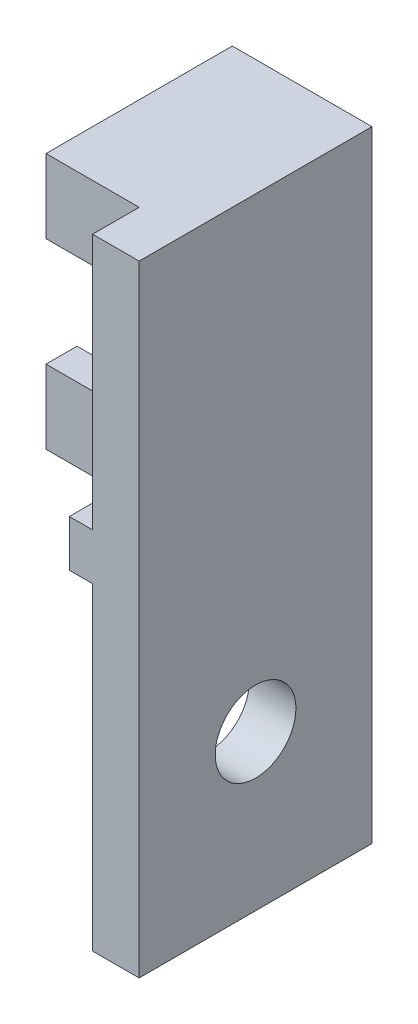
ISO-10303-21;
HEADER;
FILE_DESCRIPTION(('STEP AP214'),'2;1');
FILE_NAME('part.step','',(''),(''),'','','');
FILE_SCHEMA(('AUTOMOTIVE_DESIGN { 1 0 10303 214 1 1 1 1 }'));
ENDSEC;
DATA;
#1=APPLICATION_CONTEXT('core data for automotive mechanical design processes');
#2=APPLICATION_PROTOCOL_DEFINITION('international standard','automotive_design',2000,#1);
#3=PRODUCT_CONTEXT('',#1,'mechanical');
#4=PRODUCT('Part','Part','',(#3));
#5=PRODUCT_RELATED_PRODUCT_CATEGORY('part','',(#4));
#6=PRODUCT_DEFINITION_FORMATION('','',#4);
#7=PRODUCT_DEFINITION_CONTEXT('part definition',#1,'design');
#8=PRODUCT_DEFINITION('design','',#6,#7);
#9=PRODUCT_DEFINITION_SHAPE('','',#8);
#10=(LENGTH_UNIT() NAMED_UNIT(*) SI_UNIT(.MILLI.,.METRE.));
#11=(NAMED_UNIT(*) PLANE_ANGLE_UNIT() SI_UNIT($,.RADIAN.));
#12=(NAMED_UNIT(*) SI_UNIT($,.STERADIAN.) SOLID_ANGLE_UNIT());
#13=UNCERTAINTY_MEASURE_WITH_UNIT(LENGTH_MEASURE(1.E-05),#10,'distance_accuracy_value','');
#14=(GEOMETRIC_REPRESENTATION_CONTEXT(3) GLOBAL_UNCERTAINTY_ASSIGNED_CONTEXT((#13)) GLOBAL_UNIT_ASSIGNED_CONTEXT((#10,
#11,#12)) REPRESENTATION_CONTEXT('',''));
#15=CARTESIAN_POINT('',(0.,0.,0.));
#16=DIRECTION('',(0.,0.,1.));
#17=DIRECTION('',(1.,0.,0.));
#18=AXIS2_PLACEMENT_3D('',#15,#16,#17);
#19=CARTESIAN_POINT('',(-6.,40.,-3.));
#20=DIRECTION('',(0.,0.,-1.));
#21=DIRECTION('',(0.,1.,0.));
#22=AXIS2_PLACEMENT_3D('',#19,#20,#21);
#23=PLANE('',#22);
#24=DIRECTION('',(0.,1.,0.));
#25=VECTOR('',#24,1.);
#26=CARTESIAN_POINT('',(-6.,40.,-3.));
#27=LINE('',#26,#25);
#28=CARTESIAN_POINT('',(-6.,35.25,-3.));
#29=VERTEX_POINT('',#28);
#30=CARTESIAN_POINT('',(-6.,40.,-3.));
#31=VERTEX_POINT('',#30);
#32=EDGE_CURVE('E336',#29,#31,#27,.T.);
#33=ORIENTED_EDGE('',*,*,#32,.F.);
#34=DIRECTION('',(-1.,0.,0.));
#35=VECTOR('',#34,1.);
#36=CARTESIAN_POINT('',(0.,35.25,-3.));
#37=LINE('',#36,#35);
#38=CARTESIAN_POINT('',(0.,35.25,-3.));
#39=VERTEX_POINT('',#38);
#40=EDGE_CURVE('E321',#39,#29,#37,.T.);
#41=ORIENTED_EDGE('',*,*,#40,.F.);
#42=DIRECTION('',(0.,1.,0.));
#43=VECTOR('',#42,1.);
#44=CARTESIAN_POINT('',(0.,40.,-3.));
#45=LINE('',#44,#43);
#46=CARTESIAN_POINT('',(0.,40.,-3.));
#47=VERTEX_POINT('',#46);
#48=EDGE_CURVE('E316',#39,#47,#45,.T.);
#49=ORIENTED_EDGE('',*,*,#48,.T.);
#50=DIRECTION('',(1.,0.,0.));
#51=VECTOR('',#50,1.);
#52=CARTESIAN_POINT('',(-6.,40.,-3.));
#53=LINE('',#52,#51);
#54=EDGE_CURVE('E205',#31,#47,#53,.T.);
#55=ORIENTED_EDGE('',*,*,#54,.F.);
#56=EDGE_LOOP('',(#33,#41,#49,#55));
#57=FACE_BOUND('',#56,.T.);
#58=ADVANCED_FACE('F33',(#57),#23,.F.);
#59=CARTESIAN_POINT('',(-6.,25.,-5.));
#60=DIRECTION('',(0.,0.,1.));
#61=DIRECTION('',(1.,0.,0.));
#62=AXIS2_PLACEMENT_3D('',#59,#60,#61);
#63=PLANE('',#62);
#64=DIRECTION('',(0.,-1.,0.));
#65=VECTOR('',#64,1.);
#66=CARTESIAN_POINT('',(0.,25.,-5.));
#67=LINE('',#66,#65);
#68=CARTESIAN_POINT('',(0.,38.5,-5.));
#69=VERTEX_POINT('',#68);
#70=CARTESIAN_POINT('',(0.,35.25,-5.));
#71=VERTEX_POINT('',#70);
#72=EDGE_CURVE('E184',#69,#71,#67,.T.);
#73=ORIENTED_EDGE('',*,*,#72,.T.);
#74=DIRECTION('',(-1.,0.,0.));
#75=VECTOR('',#74,1.);
#76=CARTESIAN_POINT('',(0.,35.25,-5.));
#77=LINE('',#76,#75);
#78=CARTESIAN_POINT('',(-6.,35.25,-5.));
#79=VERTEX_POINT('',#78);
#80=EDGE_CURVE('E319',#71,#79,#77,.T.);
#81=ORIENTED_EDGE('',*,*,#80,.T.);
#82=DIRECTION('',(0.,-1.,0.));
#83=VECTOR('',#82,1.);
#84=CARTESIAN_POINT('',(-6.,25.,-5.));
#85=LINE('',#84,#83);
#86=CARTESIAN_POINT('',(-6.,38.5,-5.));
#87=VERTEX_POINT('',#86);
#88=EDGE_CURVE('E325',#87,#79,#85,.T.);
#89=ORIENTED_EDGE('',*,*,#88,.F.);
#90=DIRECTION('',(1.,0.,0.));
#91=VECTOR('',#90,1.);
#92=CARTESIAN_POINT('',(-6.,38.5,-5.));
#93=LINE('',#92,#91);
#94=EDGE_CURVE('E200',#87,#69,#93,.T.);
#95=ORIENTED_EDGE('',*,*,#94,.T.);
#96=EDGE_LOOP('',(#73,#81,#89,#95));
#97=FACE_BOUND('',#96,.T.);
#98=ADVANCED_FACE('F360',(#97),#63,.F.);
#99=CARTESIAN_POINT('',(-6.,0.,0.));
#100=DIRECTION('',(1.,0.,0.));
#101=DIRECTION('',(0.,0.,-1.));
#102=AXIS2_PLACEMENT_3D('',#99,#100,#101);
#103=PLANE('',#102);
#104=ORIENTED_EDGE('',*,*,#88,.T.);
#105=DIRECTION('',(0.,0.,-1.));
#106=VECTOR('',#105,1.);
#107=CARTESIAN_POINT('',(-6.,35.25,-3.));
#108=LINE('',#107,#106);
#109=EDGE_CURVE('E169',#29,#79,#108,.T.);
#110=ORIENTED_EDGE('',*,*,#109,.F.);
#111=ORIENTED_EDGE('',*,*,#32,.T.);
#112=DIRECTION('',(0.,0.,-1.));
#113=VECTOR('',#112,1.);
#114=CARTESIAN_POINT('',(-6.,40.,-15.));
#115=LINE('',#114,#113);
#116=CARTESIAN_POINT('',(-6.,40.,-15.));
#117=VERTEX_POINT('',#116);
#118=EDGE_CURVE('E332',#31,#117,#115,.T.);
#119=ORIENTED_EDGE('',*,*,#118,.T.);
#120=DIRECTION('',(0.,-1.,0.));
#121=VECTOR('',#120,1.);
#122=CARTESIAN_POINT('',(-6.,38.5,-15.));
#123=LINE('',#122,#121);
#124=CARTESIAN_POINT('',(-6.,38.5,-15.));
#125=VERTEX_POINT('',#124);
#126=EDGE_CURVE('E330',#117,#125,#123,.T.);
#127=ORIENTED_EDGE('',*,*,#126,.T.);
#128=DIRECTION('',(0.,0.,1.));
#129=VECTOR('',#128,1.);
#130=CARTESIAN_POINT('',(-6.,38.5,-5.));
#131=LINE('',#130,#129);
#132=EDGE_CURVE('E328',#125,#87,#131,.T.);
#133=ORIENTED_EDGE('',*,*,#132,.T.);
#134=EDGE_LOOP('',(#104,#110,#111,#119,#127,#133));
#135=FACE_BOUND('',#134,.T.);
#136=ADVANCED_FACE('F363',(#135),#103,.F.);
#137=CARTESIAN_POINT('',(0.,0.,0.));
#138=DIRECTION('',(-1.,0.,0.));
#139=DIRECTION('',(0.,0.,1.));
#140=AXIS2_PLACEMENT_3D('',#137,#138,#139);
#141=PLANE('',#140);
#142=ORIENTED_EDGE('',*,*,#72,.F.);
#143=DIRECTION('',(0.,0.,1.));
#144=VECTOR('',#143,1.);
#145=CARTESIAN_POINT('',(0.,38.5,-5.));
#146=LINE('',#145,#144);
#147=CARTESIAN_POINT('',(0.,38.5,-15.));
#148=VERTEX_POINT('',#147);
#149=EDGE_CURVE('E185',#148,#69,#146,.T.);
#150=ORIENTED_EDGE('',*,*,#149,.F.);
#151=DIRECTION('',(0.,1.,0.));
#152=VECTOR('',#151,1.);
#153=CARTESIAN_POINT('',(0.,0.,-15.));
#154=LINE('',#153,#152);
#155=CARTESIAN_POINT('',(0.,25.,-15.));
#156=VERTEX_POINT('',#155);
#157=EDGE_CURVE('E261',#156,#148,#154,.T.);
#158=ORIENTED_EDGE('',*,*,#157,.F.);
#159=DIRECTION('',(0.,0.,-1.));
#160=VECTOR('',#159,1.);
#161=CARTESIAN_POINT('',(0.,25.,-15.));
#162=LINE('',#161,#160);
#163=CARTESIAN_POINT('',(0.,25.,-5.));
#164=VERTEX_POINT('',#163);
#165=EDGE_CURVE('E183',#164,#156,#162,.T.);
#166=ORIENTED_EDGE('',*,*,#165,.F.);
#167=CARTESIAN_POINT('',(0.,28.25,-5.));
#168=VERTEX_POINT('',#167);
#169=EDGE_CURVE('E175',#168,#164,#67,.T.);
#170=ORIENTED_EDGE('',*,*,#169,.F.);
#171=DIRECTION('',(0.,0.,1.));
#172=VECTOR('',#171,1.);
#173=CARTESIAN_POINT('',(0.,28.25,-3.));
#174=LINE('',#173,#172);
#175=CARTESIAN_POINT('',(0.,28.25,-3.));
#176=VERTEX_POINT('',#175);
#177=EDGE_CURVE('E160',#168,#176,#174,.T.);
#178=ORIENTED_EDGE('',*,*,#177,.T.);
#179=CARTESIAN_POINT('',(0.,23.5,-3.));
#180=VERTEX_POINT('',#179);
#181=EDGE_CURVE('E188',#180,#176,#45,.T.);
#182=ORIENTED_EDGE('',*,*,#181,.F.);
#183=DIRECTION('',(0.,0.,-1.));
#184=VECTOR('',#183,1.);
#185=CARTESIAN_POINT('',(0.,23.5,-15.));
#186=LINE('',#185,#184);
#187=CARTESIAN_POINT('',(0.,23.5,0.));
#188=VERTEX_POINT('',#187);
#189=EDGE_CURVE('E218',#188,#180,#186,.T.);
#190=ORIENTED_EDGE('',*,*,#189,.F.);
#191=DIRECTION('',(0.,-1.,0.));
#192=VECTOR('',#191,1.);
#193=CARTESIAN_POINT('',(0.,0.,0.));
#194=LINE('',#193,#192);
#195=CARTESIAN_POINT('',(0.,40.,0.));
#196=VERTEX_POINT('',#195);
#197=EDGE_CURVE('E256',#196,#188,#194,.T.);
#198=ORIENTED_EDGE('',*,*,#197,.F.);
#199=DIRECTION('',(0.,0.,1.));
#200=VECTOR('',#199,1.);
#201=CARTESIAN_POINT('',(0.,40.,0.));
#202=LINE('',#201,#200);
#203=EDGE_CURVE('E249',#47,#196,#202,.T.);
#204=ORIENTED_EDGE('',*,*,#203,.F.);
#205=ORIENTED_EDGE('',*,*,#48,.F.);
#206=DIRECTION('',(0.,0.,-1.));
#207=VECTOR('',#206,1.);
#208=CARTESIAN_POINT('',(0.,35.25,-3.));
#209=LINE('',#208,#207);
#210=EDGE_CURVE('E168',#39,#71,#209,.T.);
#211=ORIENTED_EDGE('',*,*,#210,.T.);
#212=EDGE_LOOP('',(#142,#150,#158,#166,#170,#178,#182,#190,#198,#204,#205,#211));
#213=FACE_BOUND('',#212,.T.);
#214=ADVANCED_FACE('F181',(#213),#141,.T.);
#215=CARTESIAN_POINT('',(-1.5,23.5,-15.));
#216=DIRECTION('',(0.,-1.,0.));
#217=DIRECTION('',(0.,0.,-1.));
#218=AXIS2_PLACEMENT_3D('',#215,#216,#217);
#219=PLANE('',#218);
#220=DIRECTION('',(1.,0.,0.));
#221=VECTOR('',#220,1.);
#222=CARTESIAN_POINT('',(-6.,23.5,-3.));
#223=LINE('',#222,#221);
#224=CARTESIAN_POINT('',(-1.5,23.5,-3.));
#225=VERTEX_POINT('',#224);
#226=EDGE_CURVE('E208',#225,#180,#223,.T.);
#227=ORIENTED_EDGE('',*,*,#226,.F.);
#228=DIRECTION('',(0.,0.,-1.));
#229=VECTOR('',#228,1.);
#230=CARTESIAN_POINT('',(-1.5,23.5,-15.));
#231=LINE('',#230,#229);
#232=CARTESIAN_POINT('',(-1.5,23.5,0.));
#233=VERTEX_POINT('',#232);
#234=EDGE_CURVE('E223',#233,#225,#231,.T.);
#235=ORIENTED_EDGE('',*,*,#234,.F.);
#236=DIRECTION('',(1.,0.,0.));
#237=VECTOR('',#236,1.);
#238=CARTESIAN_POINT('',(-1.5,23.5,0.));
#239=LINE('',#238,#237);
#240=EDGE_CURVE('E226',#233,#188,#239,.T.);
#241=ORIENTED_EDGE('',*,*,#240,.T.);
#242=ORIENTED_EDGE('',*,*,#189,.T.);
#243=EDGE_LOOP('',(#227,#235,#241,#242));
#244=FACE_BOUND('',#243,.T.);
#245=ADVANCED_FACE('F305',(#244),#219,.F.);
#246=CARTESIAN_POINT('',(3.,0.,0.));
#247=DIRECTION('',(-1.,0.,0.));
#248=DIRECTION('',(0.,0.,1.));
#249=AXIS2_PLACEMENT_3D('',#246,#247,#248);
#250=PLANE('',#249);
#251=DIRECTION('',(0.,-1.,0.));
#252=VECTOR('',#251,1.);
#253=CARTESIAN_POINT('',(3.,0.,0.));
#254=LINE('',#253,#252);
#255=CARTESIAN_POINT('',(3.,40.,0.));
#256=VERTEX_POINT('',#255);
#257=CARTESIAN_POINT('',(3.,0.,0.));
#258=VERTEX_POINT('',#257);
#259=EDGE_CURVE('E245',#256,#258,#254,.T.);
#260=ORIENTED_EDGE('',*,*,#259,.T.);
#261=DIRECTION('',(0.,0.,-1.));
#262=VECTOR('',#261,1.);
#263=CARTESIAN_POINT('',(3.,0.,0.));
#264=LINE('',#263,#262);
#265=CARTESIAN_POINT('',(3.,0.,-15.));
#266=VERTEX_POINT('',#265);
#267=EDGE_CURVE('E248',#258,#266,#264,.T.);
#268=ORIENTED_EDGE('',*,*,#267,.T.);
#269=DIRECTION('',(0.,1.,0.));
#270=VECTOR('',#269,1.);
#271=CARTESIAN_POINT('',(3.,0.,-15.));
#272=LINE('',#271,#270);
#273=CARTESIAN_POINT('',(3.,40.,-15.));
#274=VERTEX_POINT('',#273);
#275=EDGE_CURVE('E251',#266,#274,#272,.T.);
#276=ORIENTED_EDGE('',*,*,#275,.T.);
#277=DIRECTION('',(0.,0.,1.));
#278=VECTOR('',#277,1.);
#279=CARTESIAN_POINT('',(3.,40.,0.));
#280=LINE('',#279,#278);
#281=EDGE_CURVE('E253',#274,#256,#280,.T.);
#282=ORIENTED_EDGE('',*,*,#281,.T.);
#283=EDGE_LOOP('',(#260,#268,#276,#282));
#284=FACE_BOUND('',#283,.T.);
#285=CARTESIAN_POINT('',(3.,10.,-7.5));
#286=DIRECTION('',(1.,0.,0.));
#287=DIRECTION('',(0.,0.,-1.));
#288=AXIS2_PLACEMENT_3D('',#285,#286,#287);
#289=CIRCLE('',#288,2.6);
#290=CARTESIAN_POINT('',(3.,10.,-10.1));
#291=VERTEX_POINT('',#290);
#292=EDGE_CURVE('E239',#291,#291,#289,.T.);
#293=ORIENTED_EDGE('',*,*,#292,.F.);
#294=EDGE_LOOP('',(#293));
#295=FACE_BOUND('',#294,.T.);
#296=ADVANCED_FACE('F386',(#284,#295),#250,.F.);
#297=DIRECTION('',(0.,0.,1.));
#298=VECTOR('',#297,1.);
#299=CARTESIAN_POINT('',(0.,20.5,-15.));
#300=LINE('',#299,#298);
#301=CARTESIAN_POINT('',(0.,20.5,-15.));
#302=VERTEX_POINT('',#301);
#303=CARTESIAN_POINT('',(0.,20.5,0.));
#304=VERTEX_POINT('',#303);
#305=EDGE_CURVE('E56',#302,#304,#300,.T.);
#306=ORIENTED_EDGE('',*,*,#305,.F.);
#307=CARTESIAN_POINT('',(0.,0.,-15.));
#308=VERTEX_POINT('',#307);
#309=EDGE_CURVE('E262',#308,#302,#154,.T.);
#310=ORIENTED_EDGE('',*,*,#309,.F.);
#311=DIRECTION('',(0.,0.,-1.));
#312=VECTOR('',#311,1.);
#313=CARTESIAN_POINT('',(0.,0.,0.));
#314=LINE('',#313,#312);
#315=CARTESIAN_POINT('',(0.,0.,0.));
#316=VERTEX_POINT('',#315);
#317=EDGE_CURVE('E259',#316,#308,#314,.T.);
#318=ORIENTED_EDGE('',*,*,#317,.F.);
#319=EDGE_CURVE('E242',#304,#316,#194,.T.);
#320=ORIENTED_EDGE('',*,*,#319,.F.);
#321=EDGE_LOOP('',(#306,#310,#318,#320));
#322=FACE_BOUND('',#321,.T.);
#323=CARTESIAN_POINT('',(0.,10.,-7.5));
#324=DIRECTION('',(1.,0.,0.));
#325=DIRECTION('',(0.,0.,-1.));
#326=AXIS2_PLACEMENT_3D('',#323,#324,#325);
#327=CIRCLE('',#326,2.6);
#328=CARTESIAN_POINT('',(0.,10.,-10.1));
#329=VERTEX_POINT('',#328);
#330=EDGE_CURVE('E238',#329,#329,#327,.T.);
#331=ORIENTED_EDGE('',*,*,#330,.T.);
#332=EDGE_LOOP('',(#331));
#333=FACE_BOUND('',#332,.T.);
#334=ADVANCED_FACE('F277',(#322,#333),#141,.T.);
#335=CARTESIAN_POINT('',(3.,0.,0.));
#336=DIRECTION('',(0.,0.,-1.));
#337=DIRECTION('',(-1.,0.,0.));
#338=AXIS2_PLACEMENT_3D('',#335,#336,#337);
#339=PLANE('',#338);
#340=ORIENTED_EDGE('',*,*,#197,.T.);
#341=ORIENTED_EDGE('',*,*,#240,.F.);
#342=DIRECTION('',(0.,1.,0.));
#343=VECTOR('',#342,1.);
#344=CARTESIAN_POINT('',(-1.5,23.5,0.));
#345=LINE('',#344,#343);
#346=CARTESIAN_POINT('',(-1.5,20.5,0.));
#347=VERTEX_POINT('',#346);
#348=EDGE_CURVE('E220',#347,#233,#345,.T.);
#349=ORIENTED_EDGE('',*,*,#348,.F.);
#350=DIRECTION('',(1.,0.,0.));
#351=VECTOR('',#350,1.);
#352=CARTESIAN_POINT('',(-1.5,20.5,0.));
#353=LINE('',#352,#351);
#354=EDGE_CURVE('E232',#347,#304,#353,.T.);
#355=ORIENTED_EDGE('',*,*,#354,.T.);
#356=ORIENTED_EDGE('',*,*,#319,.T.);
#357=DIRECTION('',(-1.,0.,0.));
#358=VECTOR('',#357,1.);
#359=CARTESIAN_POINT('',(3.,0.,0.));
#360=LINE('',#359,#358);
#361=EDGE_CURVE('E11',#258,#316,#360,.T.);
#362=ORIENTED_EDGE('',*,*,#361,.F.);
#363=ORIENTED_EDGE('',*,*,#259,.F.);
#364=DIRECTION('',(-1.,0.,0.));
#365=VECTOR('',#364,1.);
#366=CARTESIAN_POINT('',(3.,40.,0.));
#367=LINE('',#366,#365);
#368=EDGE_CURVE('E255',#256,#196,#367,.T.);
#369=ORIENTED_EDGE('',*,*,#368,.T.);
#370=EDGE_LOOP('',(#340,#341,#349,#355,#356,#362,#363,#369));
#371=FACE_BOUND('',#370,.T.);
#372=ADVANCED_FACE('F35',(#371),#339,.F.);
#373=CARTESIAN_POINT('',(3.,0.,0.));
#374=DIRECTION('',(0.,1.,0.));
#375=DIRECTION('',(0.,0.,1.));
#376=AXIS2_PLACEMENT_3D('',#373,#374,#375);
#377=PLANE('',#376);
#378=ORIENTED_EDGE('',*,*,#317,.T.);
#379=DIRECTION('',(-1.,0.,0.));
#380=VECTOR('',#379,1.);
#381=CARTESIAN_POINT('',(3.,0.,-15.));
#382=LINE('',#381,#380);
#383=EDGE_CURVE('E41',#266,#308,#382,.T.);
#384=ORIENTED_EDGE('',*,*,#383,.F.);
#385=ORIENTED_EDGE('',*,*,#267,.F.);
#386=ORIENTED_EDGE('',*,*,#361,.T.);
#387=EDGE_LOOP('',(#378,#384,#385,#386));
#388=FACE_BOUND('',#387,.T.);
#389=ADVANCED_FACE('F280',(#388),#377,.F.);
#390=CARTESIAN_POINT('',(3.,0.,-15.));
#391=DIRECTION('',(0.,0.,1.));
#392=DIRECTION('',(1.,0.,0.));
#393=AXIS2_PLACEMENT_3D('',#390,#391,#392);
#394=PLANE('',#393);
#395=DIRECTION('',(1.,0.,0.));
#396=VECTOR('',#395,1.);
#397=CARTESIAN_POINT('',(-6.,25.,-15.));
#398=LINE('',#397,#396);
#399=CARTESIAN_POINT('',(-6.,25.,-15.));
#400=VERTEX_POINT('',#399);
#401=EDGE_CURVE('E194',#400,#156,#398,.T.);
#402=ORIENTED_EDGE('',*,*,#401,.T.);
#403=ORIENTED_EDGE('',*,*,#157,.T.);
#404=DIRECTION('',(1.,0.,0.));
#405=VECTOR('',#404,1.);
#406=CARTESIAN_POINT('',(-6.,38.5,-15.));
#407=LINE('',#406,#405);
#408=EDGE_CURVE('E203',#125,#148,#407,.T.);
#409=ORIENTED_EDGE('',*,*,#408,.F.);
#410=ORIENTED_EDGE('',*,*,#126,.F.);
#411=DIRECTION('',(-1.,0.,0.));
#412=VECTOR('',#411,1.);
#413=CARTESIAN_POINT('',(3.,40.,-15.));
#414=LINE('',#413,#412);
#415=EDGE_CURVE('E267',#274,#117,#414,.T.);
#416=ORIENTED_EDGE('',*,*,#415,.F.);
#417=ORIENTED_EDGE('',*,*,#275,.F.);
#418=ORIENTED_EDGE('',*,*,#383,.T.);
#419=ORIENTED_EDGE('',*,*,#309,.T.);
#420=DIRECTION('',(1.,0.,0.));
#421=VECTOR('',#420,1.);
#422=CARTESIAN_POINT('',(-1.5,20.5,-15.));
#423=LINE('',#422,#421);
#424=CARTESIAN_POINT('',(-1.5,20.5,-15.));
#425=VERTEX_POINT('',#424);
#426=EDGE_CURVE('E235',#425,#302,#423,.T.);
#427=ORIENTED_EDGE('',*,*,#426,.F.);
#428=DIRECTION('',(0.,-1.,0.));
#429=VECTOR('',#428,1.);
#430=CARTESIAN_POINT('',(-1.5,23.5,-15.));
#431=LINE('',#430,#429);
#432=CARTESIAN_POINT('',(-1.5,23.5,-15.));
#433=VERTEX_POINT('',#432);
#434=EDGE_CURVE('E214',#433,#425,#431,.T.);
#435=ORIENTED_EDGE('',*,*,#434,.F.);
#436=DIRECTION('',(1.,0.,0.));
#437=VECTOR('',#436,1.);
#438=CARTESIAN_POINT('',(-6.,23.5,-15.));
#439=LINE('',#438,#437);
#440=CARTESIAN_POINT('',(-6.,23.5,-15.));
#441=VERTEX_POINT('',#440);
#442=EDGE_CURVE('E212',#441,#433,#439,.T.);
#443=ORIENTED_EDGE('',*,*,#442,.F.);
#444=DIRECTION('',(0.,-1.,0.));
#445=VECTOR('',#444,1.);
#446=CARTESIAN_POINT('',(-6.,23.5,-15.));
#447=LINE('',#446,#445);
#448=EDGE_CURVE('E193',#400,#441,#447,.T.);
#449=ORIENTED_EDGE('',*,*,#448,.F.);
#450=EDGE_LOOP('',(#402,#403,#409,#410,#416,#417,#418,#419,#427,#435,#443,#449));
#451=FACE_BOUND('',#450,.T.);
#452=ADVANCED_FACE('F272',(#451),#394,.F.);
#453=CARTESIAN_POINT('',(3.,40.,0.));
#454=DIRECTION('',(0.,-1.,0.));
#455=DIRECTION('',(0.,0.,-1.));
#456=AXIS2_PLACEMENT_3D('',#453,#454,#455);
#457=PLANE('',#456);
#458=ORIENTED_EDGE('',*,*,#415,.T.);
#459=ORIENTED_EDGE('',*,*,#118,.F.);
#460=ORIENTED_EDGE('',*,*,#54,.T.);
#461=ORIENTED_EDGE('',*,*,#203,.T.);
#462=ORIENTED_EDGE('',*,*,#368,.F.);
#463=ORIENTED_EDGE('',*,*,#281,.F.);
#464=EDGE_LOOP('',(#458,#459,#460,#461,#462,#463));
#465=FACE_BOUND('',#464,.T.);
#466=ADVANCED_FACE('F311',(#465),#457,.F.);
#467=CARTESIAN_POINT('',(3.,10.,-7.5));
#468=DIRECTION('',(-1.,0.,0.));
#469=DIRECTION('',(0.,0.,1.));
#470=AXIS2_PLACEMENT_3D('',#467,#468,#469);
#471=CYLINDRICAL_SURFACE('',#470,2.6);
#472=ORIENTED_EDGE('',*,*,#292,.T.);
#473=EDGE_LOOP('',(#472));
#474=FACE_BOUND('',#473,.T.);
#475=ORIENTED_EDGE('',*,*,#330,.F.);
#476=EDGE_LOOP('',(#475));
#477=FACE_BOUND('',#476,.T.);
#478=ADVANCED_FACE('F389',(#474,#477),#471,.F.);
#479=CARTESIAN_POINT('',(-1.5,20.5,-15.));
#480=DIRECTION('',(0.,1.,0.));
#481=DIRECTION('',(0.,0.,1.));
#482=AXIS2_PLACEMENT_3D('',#479,#480,#481);
#483=PLANE('',#482);
#484=ORIENTED_EDGE('',*,*,#305,.T.);
#485=ORIENTED_EDGE('',*,*,#354,.F.);
#486=DIRECTION('',(0.,0.,1.));
#487=VECTOR('',#486,1.);
#488=CARTESIAN_POINT('',(-1.5,20.5,-15.));
#489=LINE('',#488,#487);
#490=EDGE_CURVE('E217',#425,#347,#489,.T.);
#491=ORIENTED_EDGE('',*,*,#490,.F.);
#492=ORIENTED_EDGE('',*,*,#426,.T.);
#493=EDGE_LOOP('',(#484,#485,#491,#492));
#494=FACE_BOUND('',#493,.T.);
#495=ADVANCED_FACE('F287',(#494),#483,.F.);
#496=CARTESIAN_POINT('',(-1.5,0.,0.));
#497=DIRECTION('',(-1.,0.,0.));
#498=DIRECTION('',(0.,0.,1.));
#499=AXIS2_PLACEMENT_3D('',#496,#497,#498);
#500=PLANE('',#499);
#501=ORIENTED_EDGE('',*,*,#434,.T.);
#502=ORIENTED_EDGE('',*,*,#490,.T.);
#503=ORIENTED_EDGE('',*,*,#348,.T.);
#504=ORIENTED_EDGE('',*,*,#234,.T.);
#505=EDGE_CURVE('E222',#225,#433,#231,.T.);
#506=ORIENTED_EDGE('',*,*,#505,.T.);
#507=EDGE_LOOP('',(#501,#502,#503,#504,#506));
#508=FACE_BOUND('',#507,.T.);
#509=ADVANCED_FACE('F293',(#508),#500,.T.);
#510=CARTESIAN_POINT('',(-6.,23.5,-3.));
#511=DIRECTION('',(0.,1.,0.));
#512=DIRECTION('',(0.,0.,1.));
#513=AXIS2_PLACEMENT_3D('',#510,#511,#512);
#514=PLANE('',#513);
#515=ORIENTED_EDGE('',*,*,#505,.F.);
#516=CARTESIAN_POINT('',(-6.,23.5,-3.));
#517=VERTEX_POINT('',#516);
#518=EDGE_CURVE('E209',#517,#225,#223,.T.);
#519=ORIENTED_EDGE('',*,*,#518,.F.);
#520=DIRECTION('',(0.,0.,1.));
#521=VECTOR('',#520,1.);
#522=CARTESIAN_POINT('',(-6.,23.5,-3.));
#523=LINE('',#522,#521);
#524=EDGE_CURVE('E337',#441,#517,#523,.T.);
#525=ORIENTED_EDGE('',*,*,#524,.F.);
#526=ORIENTED_EDGE('',*,*,#442,.T.);
#527=EDGE_LOOP('',(#515,#519,#525,#526));
#528=FACE_BOUND('',#527,.T.);
#529=ADVANCED_FACE('F297',(#528),#514,.F.);
#530=ORIENTED_EDGE('',*,*,#181,.T.);
#531=DIRECTION('',(-1.,0.,0.));
#532=VECTOR('',#531,1.);
#533=CARTESIAN_POINT('',(0.,28.25,-3.));
#534=LINE('',#533,#532);
#535=CARTESIAN_POINT('',(-6.,28.25,-3.));
#536=VERTEX_POINT('',#535);
#537=EDGE_CURVE('E163',#176,#536,#534,.T.);
#538=ORIENTED_EDGE('',*,*,#537,.T.);
#539=EDGE_CURVE('E303',#517,#536,#27,.T.);
#540=ORIENTED_EDGE('',*,*,#539,.F.);
#541=ORIENTED_EDGE('',*,*,#518,.T.);
#542=ORIENTED_EDGE('',*,*,#226,.T.);
#543=EDGE_LOOP('',(#530,#538,#540,#541,#542));
#544=FACE_BOUND('',#543,.T.);
#545=ADVANCED_FACE('F301',(#544),#23,.F.);
#546=CARTESIAN_POINT('',(-6.,38.5,-5.));
#547=DIRECTION('',(0.,1.,0.));
#548=DIRECTION('',(0.,0.,1.));
#549=AXIS2_PLACEMENT_3D('',#546,#547,#548);
#550=PLANE('',#549);
#551=ORIENTED_EDGE('',*,*,#149,.T.);
#552=ORIENTED_EDGE('',*,*,#94,.F.);
#553=ORIENTED_EDGE('',*,*,#132,.F.);
#554=ORIENTED_EDGE('',*,*,#408,.T.);
#555=EDGE_LOOP('',(#551,#552,#553,#554));
#556=FACE_BOUND('',#555,.T.);
#557=ADVANCED_FACE('F356',(#556),#550,.F.);
#558=CARTESIAN_POINT('',(-6.,28.25,-5.));
#559=VERTEX_POINT('',#558);
#560=CARTESIAN_POINT('',(-6.,25.,-5.));
#561=VERTEX_POINT('',#560);
#562=EDGE_CURVE('E177',#559,#561,#85,.T.);
#563=ORIENTED_EDGE('',*,*,#562,.F.);
#564=DIRECTION('',(-1.,0.,0.));
#565=VECTOR('',#564,1.);
#566=CARTESIAN_POINT('',(0.,28.25,-5.));
#567=LINE('',#566,#565);
#568=EDGE_CURVE('E48',#168,#559,#567,.T.);
#569=ORIENTED_EDGE('',*,*,#568,.F.);
#570=ORIENTED_EDGE('',*,*,#169,.T.);
#571=DIRECTION('',(1.,0.,0.));
#572=VECTOR('',#571,1.);
#573=CARTESIAN_POINT('',(-6.,25.,-5.));
#574=LINE('',#573,#572);
#575=EDGE_CURVE('E197',#561,#164,#574,.T.);
#576=ORIENTED_EDGE('',*,*,#575,.F.);
#577=EDGE_LOOP('',(#563,#569,#570,#576));
#578=FACE_BOUND('',#577,.T.);
#579=ADVANCED_FACE('F173',(#578),#63,.F.);
#580=CARTESIAN_POINT('',(-6.,25.,-15.));
#581=DIRECTION('',(0.,-1.,0.));
#582=DIRECTION('',(0.,0.,-1.));
#583=AXIS2_PLACEMENT_3D('',#580,#581,#582);
#584=PLANE('',#583);
#585=ORIENTED_EDGE('',*,*,#165,.T.);
#586=ORIENTED_EDGE('',*,*,#401,.F.);
#587=DIRECTION('',(0.,0.,-1.));
#588=VECTOR('',#587,1.);
#589=CARTESIAN_POINT('',(-6.,25.,-15.));
#590=LINE('',#589,#588);
#591=EDGE_CURVE('E198',#561,#400,#590,.T.);
#592=ORIENTED_EDGE('',*,*,#591,.F.);
#593=ORIENTED_EDGE('',*,*,#575,.T.);
#594=EDGE_LOOP('',(#585,#586,#592,#593));
#595=FACE_BOUND('',#594,.T.);
#596=ADVANCED_FACE('F446',(#595),#584,.F.);
#597=ORIENTED_EDGE('',*,*,#539,.T.);
#598=DIRECTION('',(0.,0.,1.));
#599=VECTOR('',#598,1.);
#600=CARTESIAN_POINT('',(-6.,28.25,-3.));
#601=LINE('',#600,#599);
#602=EDGE_CURVE('E344',#559,#536,#601,.T.);
#603=ORIENTED_EDGE('',*,*,#602,.F.);
#604=ORIENTED_EDGE('',*,*,#562,.T.);
#605=ORIENTED_EDGE('',*,*,#591,.T.);
#606=ORIENTED_EDGE('',*,*,#448,.T.);
#607=ORIENTED_EDGE('',*,*,#524,.T.);
#608=EDGE_LOOP('',(#597,#603,#604,#605,#606,#607));
#609=FACE_BOUND('',#608,.T.);
#610=ADVANCED_FACE('F347',(#609),#103,.F.);
#611=CARTESIAN_POINT('',(0.,35.25,-3.));
#612=DIRECTION('',(0.,1.,0.));
#613=DIRECTION('',(0.,0.,1.));
#614=AXIS2_PLACEMENT_3D('',#611,#612,#613);
#615=PLANE('',#614);
#616=ORIENTED_EDGE('',*,*,#109,.T.);
#617=ORIENTED_EDGE('',*,*,#80,.F.);
#618=ORIENTED_EDGE('',*,*,#210,.F.);
#619=ORIENTED_EDGE('',*,*,#40,.T.);
#620=EDGE_LOOP('',(#616,#617,#618,#619));
#621=FACE_BOUND('',#620,.T.);
#622=ADVANCED_FACE('F503',(#621),#615,.F.);
#623=CARTESIAN_POINT('',(0.,28.25,-3.));
#624=DIRECTION('',(0.,-1.,0.));
#625=DIRECTION('',(0.,0.,-1.));
#626=AXIS2_PLACEMENT_3D('',#623,#624,#625);
#627=PLANE('',#626);
#628=ORIENTED_EDGE('',*,*,#602,.T.);
#629=ORIENTED_EDGE('',*,*,#537,.F.);
#630=ORIENTED_EDGE('',*,*,#177,.F.);
#631=ORIENTED_EDGE('',*,*,#568,.T.);
#632=EDGE_LOOP('',(#628,#629,#630,#631));
#633=FACE_BOUND('',#632,.T.);
#634=ADVANCED_FACE('F161',(#633),#627,.F.);
#635=CLOSED_SHELL('',(#58,#98,#136,#214,#245,#296,#334,#372,#389,#452,#466,#478,#495,#509,#529,
#545,#557,#579,#596,#610,#622,#634));
#636=MANIFOLD_SOLID_BREP('B2',#635);
#637=ADVANCED_BREP_SHAPE_REPRESENTATION('',(#18,#636),#14);
#638=SHAPE_DEFINITION_REPRESENTATION(#9,#637);
ENDSEC;
END-ISO-10303-21;
